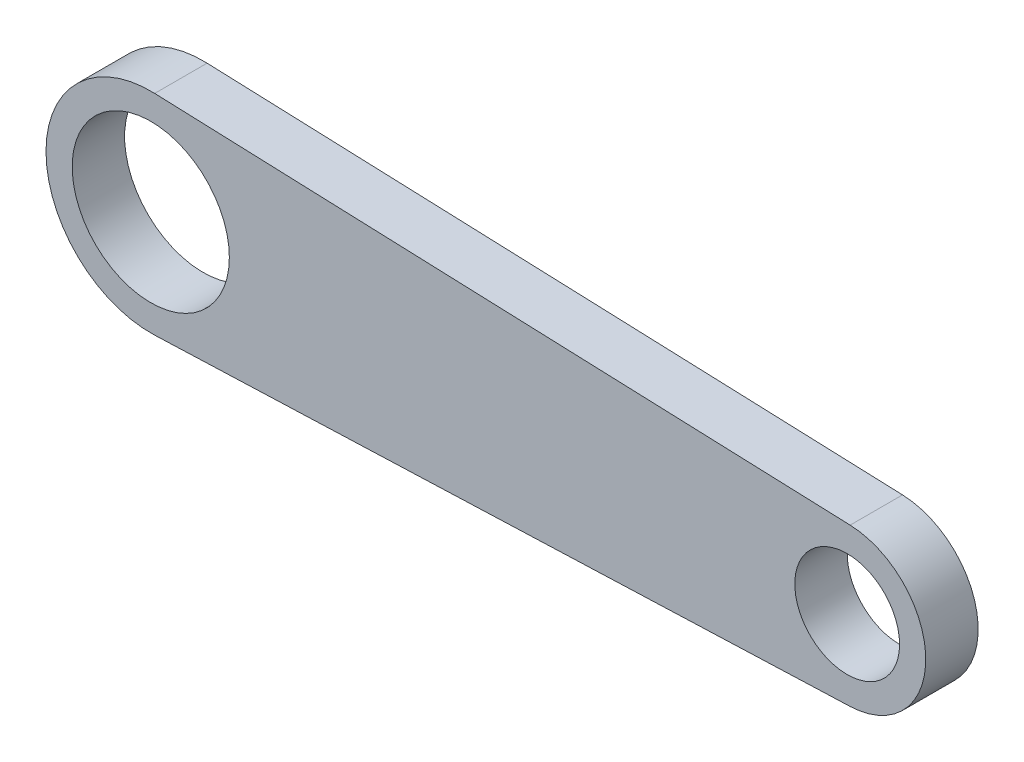
ISO-10303-21;
HEADER;
FILE_DESCRIPTION(('STEP AP214'),'2;1');
FILE_NAME('part.step','',(''),(''),'','','');
FILE_SCHEMA(('AUTOMOTIVE_DESIGN { 1 0 10303 214 1 1 1 1 }'));
ENDSEC;
DATA;
#1=APPLICATION_CONTEXT('core data for automotive mechanical design processes');
#2=APPLICATION_PROTOCOL_DEFINITION('international standard','automotive_design',2000,#1);
#3=PRODUCT_CONTEXT('',#1,'mechanical');
#4=PRODUCT('Part','Part','',(#3));
#5=PRODUCT_RELATED_PRODUCT_CATEGORY('part','',(#4));
#6=PRODUCT_DEFINITION_FORMATION('','',#4);
#7=PRODUCT_DEFINITION_CONTEXT('part definition',#1,'design');
#8=PRODUCT_DEFINITION('design','',#6,#7);
#9=PRODUCT_DEFINITION_SHAPE('','',#8);
#10=(LENGTH_UNIT() NAMED_UNIT(*) SI_UNIT(.MILLI.,.METRE.));
#11=(NAMED_UNIT(*) PLANE_ANGLE_UNIT() SI_UNIT($,.RADIAN.));
#12=(NAMED_UNIT(*) SI_UNIT($,.STERADIAN.) SOLID_ANGLE_UNIT());
#13=UNCERTAINTY_MEASURE_WITH_UNIT(LENGTH_MEASURE(1.E-05),#10,'distance_accuracy_value','');
#14=(GEOMETRIC_REPRESENTATION_CONTEXT(3) GLOBAL_UNCERTAINTY_ASSIGNED_CONTEXT((#13)) GLOBAL_UNIT_ASSIGNED_CONTEXT((#10,
#11,#12)) REPRESENTATION_CONTEXT('',''));
#15=CARTESIAN_POINT('',(0.,0.,0.));
#16=DIRECTION('',(0.,0.,1.));
#17=DIRECTION('',(1.,0.,0.));
#18=AXIS2_PLACEMENT_3D('',#15,#16,#17);
#19=CARTESIAN_POINT('',(66.47,0.,10.));
#20=DIRECTION('',(0.,0.,1.));
#21=DIRECTION('',(1.,0.,0.));
#22=AXIS2_PLACEMENT_3D('',#19,#20,#21);
#23=PLANE('',#22);
#24=CARTESIAN_POINT('',(-66.47,0.,10.));
#25=DIRECTION('',(0.,0.,1.));
#26=DIRECTION('',(1.,0.,0.));
#27=AXIS2_PLACEMENT_3D('',#24,#25,#26);
#28=CIRCLE('',#27,15.);
#29=CARTESIAN_POINT('',(-51.47,0.,10.));
#30=VERTEX_POINT('',#29);
#31=EDGE_CURVE('E123',#30,#30,#28,.T.);
#32=ORIENTED_EDGE('',*,*,#31,.F.);
#33=EDGE_LOOP('',(#32));
#34=FACE_BOUND('',#33,.T.);
#35=CARTESIAN_POINT('',(66.47,0.,10.));
#36=DIRECTION('',(0.,0.,1.));
#37=DIRECTION('',(1.,0.,0.));
#38=AXIS2_PLACEMENT_3D('',#35,#36,#37);
#39=CIRCLE('',#38,15.);
#40=CARTESIAN_POINT('',(67.0341642846397,-14.9893868673784,10.));
#41=VERTEX_POINT('',#40);
#42=CARTESIAN_POINT('',(67.0341642846397,14.9893868673784,10.));
#43=VERTEX_POINT('',#42);
#44=EDGE_CURVE('E102',#41,#43,#39,.T.);
#45=ORIENTED_EDGE('',*,*,#44,.T.);
#46=DIRECTION('',(-0.999292457825229,0.0376109523093124,0.));
#47=VECTOR('',#46,1.);
#48=CARTESIAN_POINT('',(-65.7177809538138,19.9858491565046,10.));
#49=LINE('',#48,#47);
#50=CARTESIAN_POINT('',(-65.7177809538138,19.9858491565046,10.));
#51=VERTEX_POINT('',#50);
#52=EDGE_CURVE('E96',#43,#51,#49,.T.);
#53=ORIENTED_EDGE('',*,*,#52,.T.);
#54=CARTESIAN_POINT('',(-66.47,0.,10.));
#55=DIRECTION('',(0.,0.,1.));
#56=DIRECTION('',(1.,0.,0.));
#57=AXIS2_PLACEMENT_3D('',#54,#55,#56);
#58=CIRCLE('',#57,20.);
#59=CARTESIAN_POINT('',(-65.7177809538138,-19.9858491565046,10.));
#60=VERTEX_POINT('',#59);
#61=EDGE_CURVE('E100',#51,#60,#58,.T.);
#62=ORIENTED_EDGE('',*,*,#61,.T.);
#63=DIRECTION('',(0.999292457825229,0.0376109523093124,0.));
#64=VECTOR('',#63,1.);
#65=CARTESIAN_POINT('',(-65.7177809538138,-19.9858491565046,10.));
#66=LINE('',#65,#64);
#67=EDGE_CURVE('E63',#60,#41,#66,.T.);
#68=ORIENTED_EDGE('',*,*,#67,.T.);
#69=EDGE_LOOP('',(#45,#53,#62,#68));
#70=FACE_BOUND('',#69,.T.);
#71=CARTESIAN_POINT('',(66.47,0.,10.));
#72=DIRECTION('',(0.,0.,1.));
#73=DIRECTION('',(1.,0.,0.));
#74=AXIS2_PLACEMENT_3D('',#71,#72,#73);
#75=CIRCLE('',#74,9.99999999999999);
#76=CARTESIAN_POINT('',(76.47,0.,10.));
#77=VERTEX_POINT('',#76);
#78=EDGE_CURVE('E145',#77,#77,#75,.T.);
#79=ORIENTED_EDGE('',*,*,#78,.F.);
#80=EDGE_LOOP('',(#79));
#81=FACE_BOUND('',#80,.T.);
#82=ADVANCED_FACE('F43',(#34,#70,#81),#23,.T.);
#83=CARTESIAN_POINT('',(66.47,0.,0.));
#84=DIRECTION('',(0.,0.,1.));
#85=DIRECTION('',(1.,0.,0.));
#86=AXIS2_PLACEMENT_3D('',#83,#84,#85);
#87=PLANE('',#86);
#88=CARTESIAN_POINT('',(66.47,0.,0.));
#89=DIRECTION('',(0.,0.,1.));
#90=DIRECTION('',(1.,0.,0.));
#91=AXIS2_PLACEMENT_3D('',#88,#89,#90);
#92=CIRCLE('',#91,15.);
#93=CARTESIAN_POINT('',(67.0341642846397,-14.9893868673784,0.));
#94=VERTEX_POINT('',#93);
#95=CARTESIAN_POINT('',(67.0341642846397,14.9893868673784,0.));
#96=VERTEX_POINT('',#95);
#97=EDGE_CURVE('E119',#94,#96,#92,.T.);
#98=ORIENTED_EDGE('',*,*,#97,.F.);
#99=DIRECTION('',(0.999292457825229,0.0376109523093124,0.));
#100=VECTOR('',#99,1.);
#101=CARTESIAN_POINT('',(-65.7177809538138,-19.9858491565046,0.));
#102=LINE('',#101,#100);
#103=CARTESIAN_POINT('',(-65.7177809538138,-19.9858491565046,0.));
#104=VERTEX_POINT('',#103);
#105=EDGE_CURVE('E88',#104,#94,#102,.T.);
#106=ORIENTED_EDGE('',*,*,#105,.F.);
#107=CARTESIAN_POINT('',(-66.47,0.,0.));
#108=DIRECTION('',(0.,0.,1.));
#109=DIRECTION('',(1.,0.,0.));
#110=AXIS2_PLACEMENT_3D('',#107,#108,#109);
#111=CIRCLE('',#110,20.);
#112=CARTESIAN_POINT('',(-65.7177809538138,19.9858491565046,0.));
#113=VERTEX_POINT('',#112);
#114=EDGE_CURVE('E82',#113,#104,#111,.T.);
#115=ORIENTED_EDGE('',*,*,#114,.F.);
#116=DIRECTION('',(-0.999292457825229,0.0376109523093124,0.));
#117=VECTOR('',#116,1.);
#118=CARTESIAN_POINT('',(-65.7177809538138,19.9858491565046,0.));
#119=LINE('',#118,#117);
#120=EDGE_CURVE('E107',#96,#113,#119,.T.);
#121=ORIENTED_EDGE('',*,*,#120,.F.);
#122=EDGE_LOOP('',(#98,#106,#115,#121));
#123=FACE_BOUND('',#122,.T.);
#124=CARTESIAN_POINT('',(-66.47,0.,0.));
#125=DIRECTION('',(0.,0.,1.));
#126=DIRECTION('',(1.,0.,0.));
#127=AXIS2_PLACEMENT_3D('',#124,#125,#126);
#128=CIRCLE('',#127,15.);
#129=CARTESIAN_POINT('',(-51.47,0.,0.));
#130=VERTEX_POINT('',#129);
#131=EDGE_CURVE('E141',#130,#130,#128,.T.);
#132=ORIENTED_EDGE('',*,*,#131,.T.);
#133=EDGE_LOOP('',(#132));
#134=FACE_BOUND('',#133,.T.);
#135=CARTESIAN_POINT('',(66.47,0.,0.));
#136=DIRECTION('',(0.,0.,1.));
#137=DIRECTION('',(1.,0.,0.));
#138=AXIS2_PLACEMENT_3D('',#135,#136,#137);
#139=CIRCLE('',#138,9.99999999999999);
#140=CARTESIAN_POINT('',(76.47,0.,0.));
#141=VERTEX_POINT('',#140);
#142=EDGE_CURVE('E149',#141,#141,#139,.T.);
#143=ORIENTED_EDGE('',*,*,#142,.T.);
#144=EDGE_LOOP('',(#143));
#145=FACE_BOUND('',#144,.T.);
#146=ADVANCED_FACE('F134',(#123,#134,#145),#87,.F.);
#147=CARTESIAN_POINT('',(66.47,0.,10.));
#148=DIRECTION('',(0.,0.,-1.));
#149=DIRECTION('',(-1.,0.,0.));
#150=AXIS2_PLACEMENT_3D('',#147,#148,#149);
#151=CYLINDRICAL_SURFACE('',#150,15.);
#152=ORIENTED_EDGE('',*,*,#97,.T.);
#153=DIRECTION('',(0.,0.,-1.));
#154=VECTOR('',#153,1.);
#155=CARTESIAN_POINT('',(67.0341642846397,14.9893868673784,10.));
#156=LINE('',#155,#154);
#157=EDGE_CURVE('E11',#43,#96,#156,.T.);
#158=ORIENTED_EDGE('',*,*,#157,.F.);
#159=ORIENTED_EDGE('',*,*,#44,.F.);
#160=DIRECTION('',(0.,0.,-1.));
#161=VECTOR('',#160,1.);
#162=CARTESIAN_POINT('',(67.0341642846397,-14.9893868673784,10.));
#163=LINE('',#162,#161);
#164=EDGE_CURVE('E115',#41,#94,#163,.T.);
#165=ORIENTED_EDGE('',*,*,#164,.T.);
#166=EDGE_LOOP('',(#152,#158,#159,#165));
#167=FACE_BOUND('',#166,.T.);
#168=ADVANCED_FACE('F45',(#167),#151,.T.);
#169=CARTESIAN_POINT('',(-65.7177809538138,19.9858491565046,10.));
#170=DIRECTION('',(-0.0376109523093124,-0.999292457825229,0.));
#171=DIRECTION('',(0.999292457825229,-0.0376109523093124,0.));
#172=AXIS2_PLACEMENT_3D('',#169,#170,#171);
#173=PLANE('',#172);
#174=ORIENTED_EDGE('',*,*,#120,.T.);
#175=DIRECTION('',(0.,0.,-1.));
#176=VECTOR('',#175,1.);
#177=CARTESIAN_POINT('',(-65.7177809538138,19.9858491565046,10.));
#178=LINE('',#177,#176);
#179=EDGE_CURVE('E53',#51,#113,#178,.T.);
#180=ORIENTED_EDGE('',*,*,#179,.F.);
#181=ORIENTED_EDGE('',*,*,#52,.F.);
#182=ORIENTED_EDGE('',*,*,#157,.T.);
#183=EDGE_LOOP('',(#174,#180,#181,#182));
#184=FACE_BOUND('',#183,.T.);
#185=ADVANCED_FACE('F106',(#184),#173,.F.);
#186=CARTESIAN_POINT('',(-66.47,0.,10.));
#187=DIRECTION('',(0.,0.,-1.));
#188=DIRECTION('',(-1.,0.,0.));
#189=AXIS2_PLACEMENT_3D('',#186,#187,#188);
#190=CYLINDRICAL_SURFACE('',#189,20.);
#191=ORIENTED_EDGE('',*,*,#114,.T.);
#192=DIRECTION('',(0.,0.,-1.));
#193=VECTOR('',#192,1.);
#194=CARTESIAN_POINT('',(-65.7177809538138,-19.9858491565046,10.));
#195=LINE('',#194,#193);
#196=EDGE_CURVE('E109',#60,#104,#195,.T.);
#197=ORIENTED_EDGE('',*,*,#196,.F.);
#198=ORIENTED_EDGE('',*,*,#61,.F.);
#199=ORIENTED_EDGE('',*,*,#179,.T.);
#200=EDGE_LOOP('',(#191,#197,#198,#199));
#201=FACE_BOUND('',#200,.T.);
#202=ADVANCED_FACE('F110',(#201),#190,.T.);
#203=CARTESIAN_POINT('',(-65.7177809538138,-19.9858491565046,10.));
#204=DIRECTION('',(-0.0376109523093124,0.999292457825229,0.));
#205=DIRECTION('',(-0.999292457825229,-0.0376109523093124,0.));
#206=AXIS2_PLACEMENT_3D('',#203,#204,#205);
#207=PLANE('',#206);
#208=ORIENTED_EDGE('',*,*,#105,.T.);
#209=ORIENTED_EDGE('',*,*,#164,.F.);
#210=ORIENTED_EDGE('',*,*,#67,.F.);
#211=ORIENTED_EDGE('',*,*,#196,.T.);
#212=EDGE_LOOP('',(#208,#209,#210,#211));
#213=FACE_BOUND('',#212,.T.);
#214=ADVANCED_FACE('F131',(#213),#207,.F.);
#215=CARTESIAN_POINT('',(-66.47,0.,10.));
#216=DIRECTION('',(0.,0.,-1.));
#217=DIRECTION('',(-1.,0.,0.));
#218=AXIS2_PLACEMENT_3D('',#215,#216,#217);
#219=CYLINDRICAL_SURFACE('',#218,15.);
#220=ORIENTED_EDGE('',*,*,#31,.T.);
#221=EDGE_LOOP('',(#220));
#222=FACE_BOUND('',#221,.T.);
#223=ORIENTED_EDGE('',*,*,#131,.F.);
#224=EDGE_LOOP('',(#223));
#225=FACE_BOUND('',#224,.T.);
#226=ADVANCED_FACE('F166',(#222,#225),#219,.F.);
#227=CARTESIAN_POINT('',(66.47,0.,10.));
#228=DIRECTION('',(0.,0.,-1.));
#229=DIRECTION('',(-1.,0.,0.));
#230=AXIS2_PLACEMENT_3D('',#227,#228,#229);
#231=CYLINDRICAL_SURFACE('',#230,9.99999999999999);
#232=ORIENTED_EDGE('',*,*,#78,.T.);
#233=EDGE_LOOP('',(#232));
#234=FACE_BOUND('',#233,.T.);
#235=ORIENTED_EDGE('',*,*,#142,.F.);
#236=EDGE_LOOP('',(#235));
#237=FACE_BOUND('',#236,.T.);
#238=ADVANCED_FACE('F155',(#234,#237),#231,.F.);
#239=CLOSED_SHELL('',(#82,#146,#168,#185,#202,#214,#226,#238));
#240=MANIFOLD_SOLID_BREP('B2',#239);
#241=ADVANCED_BREP_SHAPE_REPRESENTATION('',(#18,#240),#14);
#242=SHAPE_DEFINITION_REPRESENTATION(#9,#241);
ENDSEC;
END-ISO-10303-21;
